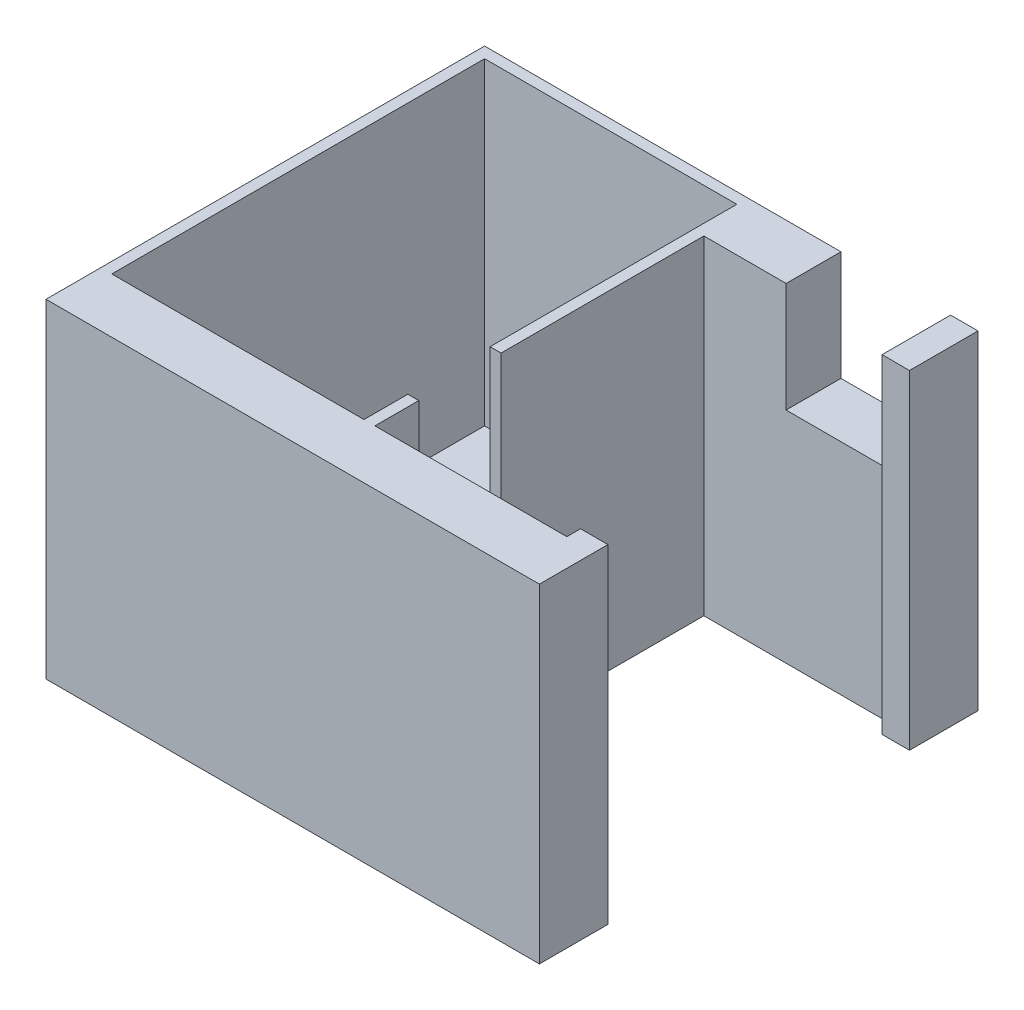
ISO-10303-21;
HEADER;
FILE_DESCRIPTION(('STEP AP214'),'2;1');
FILE_NAME('part.step','',(''),(''),'','','');
FILE_SCHEMA(('AUTOMOTIVE_DESIGN { 1 0 10303 214 1 1 1 1 }'));
ENDSEC;
DATA;
#1=APPLICATION_CONTEXT('core data for automotive mechanical design processes');
#2=APPLICATION_PROTOCOL_DEFINITION('international standard','automotive_design',2000,#1);
#3=PRODUCT_CONTEXT('',#1,'mechanical');
#4=PRODUCT('Part','Part','',(#3));
#5=PRODUCT_RELATED_PRODUCT_CATEGORY('part','',(#4));
#6=PRODUCT_DEFINITION_FORMATION('','',#4);
#7=PRODUCT_DEFINITION_CONTEXT('part definition',#1,'design');
#8=PRODUCT_DEFINITION('design','',#6,#7);
#9=PRODUCT_DEFINITION_SHAPE('','',#8);
#10=(LENGTH_UNIT() NAMED_UNIT(*) SI_UNIT(.MILLI.,.METRE.));
#11=(NAMED_UNIT(*) PLANE_ANGLE_UNIT() SI_UNIT($,.RADIAN.));
#12=(NAMED_UNIT(*) SI_UNIT($,.STERADIAN.) SOLID_ANGLE_UNIT());
#13=UNCERTAINTY_MEASURE_WITH_UNIT(LENGTH_MEASURE(1.E-05),#10,'distance_accuracy_value','');
#14=(GEOMETRIC_REPRESENTATION_CONTEXT(3) GLOBAL_UNCERTAINTY_ASSIGNED_CONTEXT((#13)) GLOBAL_UNIT_ASSIGNED_CONTEXT((#10,
#11,#12)) REPRESENTATION_CONTEXT('',''));
#15=CARTESIAN_POINT('',(0.,0.,0.));
#16=DIRECTION('',(0.,0.,1.));
#17=DIRECTION('',(1.,0.,0.));
#18=AXIS2_PLACEMENT_3D('',#15,#16,#17);
#19=CARTESIAN_POINT('',(0.,60.,0.));
#20=DIRECTION('',(0.,1.,0.));
#21=DIRECTION('',(0.,0.,1.));
#22=AXIS2_PLACEMENT_3D('',#19,#20,#21);
#23=PLANE('',#22);
#24=DIRECTION('',(1.,0.,0.));
#25=VECTOR('',#24,1.);
#26=CARTESIAN_POINT('',(29.8030592734225,60.,38.2284894837476));
#27=LINE('',#26,#25);
#28=CARTESIAN_POINT('',(34.8030592734225,60.,38.2284894837476));
#29=VERTEX_POINT('',#28);
#30=CARTESIAN_POINT('',(39.8030592734225,60.,38.2284894837476));
#31=VERTEX_POINT('',#30);
#32=EDGE_CURVE('E197',#29,#31,#27,.T.);
#33=ORIENTED_EDGE('',*,*,#32,.F.);
#34=DIRECTION('',(0.,0.,-1.));
#35=VECTOR('',#34,1.);
#36=CARTESIAN_POINT('',(34.8030592734225,60.,-19.2715105162524));
#37=LINE('',#36,#35);
#38=CARTESIAN_POINT('',(34.8030592734225,60.,40.7284894837476));
#39=VERTEX_POINT('',#38);
#40=EDGE_CURVE('E455',#39,#29,#37,.T.);
#41=ORIENTED_EDGE('',*,*,#40,.F.);
#42=DIRECTION('',(1.,0.,0.));
#43=VECTOR('',#42,1.);
#44=CARTESIAN_POINT('',(-0.196940726577458,60.,40.7284894837476));
#45=LINE('',#44,#43);
#46=CARTESIAN_POINT('',(-0.196940726577458,60.,40.7284894837476));
#47=VERTEX_POINT('',#46);
#48=EDGE_CURVE('E451',#47,#39,#45,.T.);
#49=ORIENTED_EDGE('',*,*,#48,.F.);
#50=DIRECTION('',(0.,0.,1.));
#51=VECTOR('',#50,1.);
#52=CARTESIAN_POINT('',(-0.196940726577466,60.,-19.2715105162524));
#53=LINE('',#52,#51);
#54=CARTESIAN_POINT('',(-0.196940726577458,60.,32.7284894837476));
#55=VERTEX_POINT('',#54);
#56=EDGE_CURVE('E277',#55,#47,#53,.T.);
#57=ORIENTED_EDGE('',*,*,#56,.F.);
#58=DIRECTION('',(-1.,0.,0.));
#59=VECTOR('',#58,1.);
#60=CARTESIAN_POINT('',(52.0045918179753,60.,32.7284894837476));
#61=LINE('',#60,#59);
#62=CARTESIAN_POINT('',(-2.19694072657747,60.,32.7284894837476));
#63=VERTEX_POINT('',#62);
#64=EDGE_CURVE('E379',#55,#63,#61,.T.);
#65=ORIENTED_EDGE('',*,*,#64,.T.);
#66=DIRECTION('',(0.,0.,1.));
#67=VECTOR('',#66,1.);
#68=CARTESIAN_POINT('',(-2.19694072657747,60.,0.));
#69=LINE('',#68,#67);
#70=CARTESIAN_POINT('',(-2.19694072657747,60.,40.7284894837476));
#71=VERTEX_POINT('',#70);
#72=EDGE_CURVE('E421',#63,#71,#69,.T.);
#73=ORIENTED_EDGE('',*,*,#72,.T.);
#74=DIRECTION('',(-1.,0.,0.));
#75=VECTOR('',#74,1.);
#76=CARTESIAN_POINT('',(0.,60.,40.7284894837476));
#77=LINE('',#76,#75);
#78=CARTESIAN_POINT('',(-48.1969407265775,60.,40.7284894837476));
#79=VERTEX_POINT('',#78);
#80=EDGE_CURVE('E426',#71,#79,#77,.T.);
#81=ORIENTED_EDGE('',*,*,#80,.T.);
#82=DIRECTION('',(0.,0.,-1.));
#83=VECTOR('',#82,1.);
#84=CARTESIAN_POINT('',(-48.1969407265775,60.,0.));
#85=LINE('',#84,#83);
#86=CARTESIAN_POINT('',(-48.1969407265775,60.,-27.2715105162524));
#87=VERTEX_POINT('',#86);
#88=EDGE_CURVE('E400',#79,#87,#85,.T.);
#89=ORIENTED_EDGE('',*,*,#88,.T.);
#90=DIRECTION('',(1.,0.,0.));
#91=VECTOR('',#90,1.);
#92=CARTESIAN_POINT('',(0.,60.,-27.2715105162524));
#93=LINE('',#92,#91);
#94=CARTESIAN_POINT('',(-2.19694072657747,60.,-27.2715105162524));
#95=VERTEX_POINT('',#94);
#96=EDGE_CURVE('E417',#87,#95,#93,.T.);
#97=ORIENTED_EDGE('',*,*,#96,.T.);
#98=CARTESIAN_POINT('',(-2.19694072657747,60.,17.7284894837476));
#99=VERTEX_POINT('',#98);
#100=EDGE_CURVE('E422',#95,#99,#69,.T.);
#101=ORIENTED_EDGE('',*,*,#100,.T.);
#102=DIRECTION('',(-1.,0.,0.));
#103=VECTOR('',#102,1.);
#104=CARTESIAN_POINT('',(52.0045918179753,60.,17.7284894837476));
#105=LINE('',#104,#103);
#106=CARTESIAN_POINT('',(-0.196940726577458,60.,17.7284894837476));
#107=VERTEX_POINT('',#106);
#108=EDGE_CURVE('E368',#107,#99,#105,.T.);
#109=ORIENTED_EDGE('',*,*,#108,.F.);
#110=CARTESIAN_POINT('',(-0.196940726577466,60.,-19.2715105162524));
#111=VERTEX_POINT('',#110);
#112=EDGE_CURVE('E447',#111,#107,#53,.T.);
#113=ORIENTED_EDGE('',*,*,#112,.F.);
#114=DIRECTION('',(-1.,0.,0.));
#115=VECTOR('',#114,1.);
#116=CARTESIAN_POINT('',(-0.196940726577466,60.,-19.2715105162524));
#117=LINE('',#116,#115);
#118=CARTESIAN_POINT('',(14.8030592734225,60.,-19.2715105162524));
#119=VERTEX_POINT('',#118);
#120=EDGE_CURVE('E282',#119,#111,#117,.T.);
#121=ORIENTED_EDGE('',*,*,#120,.F.);
#122=DIRECTION('',(0.,0.,-1.));
#123=VECTOR('',#122,1.);
#124=CARTESIAN_POINT('',(14.8030592734225,60.,9.01276073120952));
#125=LINE('',#124,#123);
#126=CARTESIAN_POINT('',(14.8030592734225,60.,-29.2715105162524));
#127=VERTEX_POINT('',#126);
#128=EDGE_CURVE('E324',#119,#127,#125,.T.);
#129=ORIENTED_EDGE('',*,*,#128,.T.);
#130=DIRECTION('',(-1.,0.,0.));
#131=VECTOR('',#130,1.);
#132=CARTESIAN_POINT('',(-50.1969407265775,60.,-29.2715105162524));
#133=LINE('',#132,#131);
#134=CARTESIAN_POINT('',(-50.1969407265775,60.,-29.2715105162524));
#135=VERTEX_POINT('',#134);
#136=EDGE_CURVE('E303',#127,#135,#133,.T.);
#137=ORIENTED_EDGE('',*,*,#136,.T.);
#138=DIRECTION('',(0.,0.,1.));
#139=VECTOR('',#138,1.);
#140=CARTESIAN_POINT('',(-50.1969407265775,60.,-29.2715105162524));
#141=LINE('',#140,#139);
#142=CARTESIAN_POINT('',(-50.1969407265774,60.,50.7284894837476));
#143=VERTEX_POINT('',#142);
#144=EDGE_CURVE('E227',#135,#143,#141,.T.);
#145=ORIENTED_EDGE('',*,*,#144,.T.);
#146=DIRECTION('',(1.,0.,0.));
#147=VECTOR('',#146,1.);
#148=CARTESIAN_POINT('',(-50.1969407265774,60.,50.7284894837476));
#149=LINE('',#148,#147);
#150=CARTESIAN_POINT('',(39.8030592734225,60.,50.7284894837476));
#151=VERTEX_POINT('',#150);
#152=EDGE_CURVE('E296',#143,#151,#149,.T.);
#153=ORIENTED_EDGE('',*,*,#152,.T.);
#154=DIRECTION('',(0.,0.,-1.));
#155=VECTOR('',#154,1.);
#156=CARTESIAN_POINT('',(39.8030592734225,60.,-29.2715105162524));
#157=LINE('',#156,#155);
#158=EDGE_CURVE('E300',#151,#31,#157,.T.);
#159=ORIENTED_EDGE('',*,*,#158,.T.);
#160=EDGE_LOOP('',(#33,#41,#49,#57,#65,#73,#81,#89,#97,#101,#109,#113,#121,#129,#137,#145,#153,#159));
#161=FACE_BOUND('',#160,.T.);
#162=ADVANCED_FACE('F41',(#161),#23,.T.);
#163=CARTESIAN_POINT('',(39.8030592734225,60.,-29.2715105162524));
#164=DIRECTION('',(-1.,0.,0.));
#165=DIRECTION('',(0.,0.,1.));
#166=AXIS2_PLACEMENT_3D('',#163,#164,#165);
#167=PLANE('',#166);
#168=DIRECTION('',(0.,0.,-1.));
#169=VECTOR('',#168,1.);
#170=CARTESIAN_POINT('',(39.8030592734225,0.,-29.2715105162524));
#171=LINE('',#170,#169);
#172=CARTESIAN_POINT('',(39.8030592734225,0.,50.7284894837476));
#173=VERTEX_POINT('',#172);
#174=CARTESIAN_POINT('',(39.8030592734225,0.,38.2284894837476));
#175=VERTEX_POINT('',#174);
#176=EDGE_CURVE('E210',#173,#175,#171,.T.);
#177=ORIENTED_EDGE('',*,*,#176,.T.);
#178=DIRECTION('',(0.,-1.,0.));
#179=VECTOR('',#178,1.);
#180=CARTESIAN_POINT('',(39.8030592734225,60.,38.2284894837476));
#181=LINE('',#180,#179);
#182=EDGE_CURVE('E194',#31,#175,#181,.T.);
#183=ORIENTED_EDGE('',*,*,#182,.F.);
#184=ORIENTED_EDGE('',*,*,#158,.F.);
#185=DIRECTION('',(0.,-1.,0.));
#186=VECTOR('',#185,1.);
#187=CARTESIAN_POINT('',(39.8030592734225,60.,50.7284894837476));
#188=LINE('',#187,#186);
#189=EDGE_CURVE('E220',#151,#173,#188,.T.);
#190=ORIENTED_EDGE('',*,*,#189,.T.);
#191=EDGE_LOOP('',(#177,#183,#184,#190));
#192=FACE_BOUND('',#191,.T.);
#193=ADVANCED_FACE('F218',(#192),#167,.F.);
#194=CARTESIAN_POINT('',(34.8030592734225,60.,-19.2715105162524));
#195=DIRECTION('',(-1.,0.,0.));
#196=DIRECTION('',(0.,0.,1.));
#197=AXIS2_PLACEMENT_3D('',#194,#195,#196);
#198=PLANE('',#197);
#199=DIRECTION('',(0.,1.,0.));
#200=VECTOR('',#199,1.);
#201=CARTESIAN_POINT('',(34.8030592734225,60.,38.2284894837476));
#202=LINE('',#201,#200);
#203=CARTESIAN_POINT('',(34.8030592734225,0.,38.2284894837476));
#204=VERTEX_POINT('',#203);
#205=EDGE_CURVE('E12',#204,#29,#202,.T.);
#206=ORIENTED_EDGE('',*,*,#205,.F.);
#207=DIRECTION('',(0.,0.,-1.));
#208=VECTOR('',#207,1.);
#209=CARTESIAN_POINT('',(34.8030592734225,0.,-19.2715105162524));
#210=LINE('',#209,#208);
#211=CARTESIAN_POINT('',(34.8030592734225,0.,40.7284894837476));
#212=VERTEX_POINT('',#211);
#213=EDGE_CURVE('E213',#212,#204,#210,.T.);
#214=ORIENTED_EDGE('',*,*,#213,.F.);
#215=DIRECTION('',(0.,-1.,0.));
#216=VECTOR('',#215,1.);
#217=CARTESIAN_POINT('',(34.8030592734225,60.,40.7284894837476));
#218=LINE('',#217,#216);
#219=EDGE_CURVE('E285',#39,#212,#218,.T.);
#220=ORIENTED_EDGE('',*,*,#219,.F.);
#221=ORIENTED_EDGE('',*,*,#40,.T.);
#222=EDGE_LOOP('',(#206,#214,#220,#221));
#223=FACE_BOUND('',#222,.T.);
#224=ADVANCED_FACE('F529',(#223),#198,.T.);
#225=DIRECTION('',(1.,0.,0.));
#226=VECTOR('',#225,1.);
#227=CARTESIAN_POINT('',(29.8030592734225,60.,-16.7715105162524));
#228=LINE('',#227,#226);
#229=CARTESIAN_POINT('',(34.8030592734225,60.,-16.7715105162524));
#230=VERTEX_POINT('',#229);
#231=CARTESIAN_POINT('',(39.8030592734225,60.,-16.7715105162524));
#232=VERTEX_POINT('',#231);
#233=EDGE_CURVE('E57',#230,#232,#228,.T.);
#234=ORIENTED_EDGE('',*,*,#233,.T.);
#235=CARTESIAN_POINT('',(39.8030592734225,60.,-29.2715105162524));
#236=VERTEX_POINT('',#235);
#237=EDGE_CURVE('E299',#232,#236,#157,.T.);
#238=ORIENTED_EDGE('',*,*,#237,.T.);
#239=CARTESIAN_POINT('',(34.8030592734225,60.,-29.2715105162524));
#240=VERTEX_POINT('',#239);
#241=EDGE_CURVE('E238',#236,#240,#133,.T.);
#242=ORIENTED_EDGE('',*,*,#241,.T.);
#243=EDGE_CURVE('E454',#230,#240,#37,.T.);
#244=ORIENTED_EDGE('',*,*,#243,.F.);
#245=EDGE_LOOP('',(#234,#238,#242,#244));
#246=FACE_BOUND('',#245,.T.);
#247=ADVANCED_FACE('F330',(#246),#23,.T.);
#248=CARTESIAN_POINT('',(0.,0.,0.));
#249=DIRECTION('',(0.,1.,0.));
#250=DIRECTION('',(0.,0.,1.));
#251=AXIS2_PLACEMENT_3D('',#248,#249,#250);
#252=PLANE('',#251);
#253=ORIENTED_EDGE('',*,*,#213,.T.);
#254=DIRECTION('',(1.,0.,0.));
#255=VECTOR('',#254,1.);
#256=CARTESIAN_POINT('',(29.8030592734225,0.,38.2284894837476));
#257=LINE('',#256,#255);
#258=EDGE_CURVE('E64',#204,#175,#257,.T.);
#259=ORIENTED_EDGE('',*,*,#258,.T.);
#260=ORIENTED_EDGE('',*,*,#176,.F.);
#261=DIRECTION('',(1.,0.,0.));
#262=VECTOR('',#261,1.);
#263=CARTESIAN_POINT('',(-50.1969407265774,0.,50.7284894837476));
#264=LINE('',#263,#262);
#265=CARTESIAN_POINT('',(-50.1969407265774,0.,50.7284894837476));
#266=VERTEX_POINT('',#265);
#267=EDGE_CURVE('E229',#266,#173,#264,.T.);
#268=ORIENTED_EDGE('',*,*,#267,.F.);
#269=DIRECTION('',(0.,0.,1.));
#270=VECTOR('',#269,1.);
#271=CARTESIAN_POINT('',(-50.1969407265775,0.,-29.2715105162524));
#272=LINE('',#271,#270);
#273=CARTESIAN_POINT('',(-50.1969407265775,0.,-29.2715105162524));
#274=VERTEX_POINT('',#273);
#275=EDGE_CURVE('E292',#274,#266,#272,.T.);
#276=ORIENTED_EDGE('',*,*,#275,.F.);
#277=DIRECTION('',(-1.,0.,0.));
#278=VECTOR('',#277,1.);
#279=CARTESIAN_POINT('',(-50.1969407265775,0.,-29.2715105162524));
#280=LINE('',#279,#278);
#281=CARTESIAN_POINT('',(39.8030592734225,0.,-29.2715105162524));
#282=VERTEX_POINT('',#281);
#283=EDGE_CURVE('E222',#282,#274,#280,.T.);
#284=ORIENTED_EDGE('',*,*,#283,.F.);
#285=CARTESIAN_POINT('',(39.8030592734225,0.,-16.7715105162524));
#286=VERTEX_POINT('',#285);
#287=EDGE_CURVE('E223',#286,#282,#171,.T.);
#288=ORIENTED_EDGE('',*,*,#287,.F.);
#289=DIRECTION('',(1.,0.,0.));
#290=VECTOR('',#289,1.);
#291=CARTESIAN_POINT('',(29.8030592734225,0.,-16.7715105162524));
#292=LINE('',#291,#290);
#293=CARTESIAN_POINT('',(34.8030592734225,0.,-16.7715105162524));
#294=VERTEX_POINT('',#293);
#295=EDGE_CURVE('E215',#294,#286,#292,.T.);
#296=ORIENTED_EDGE('',*,*,#295,.F.);
#297=CARTESIAN_POINT('',(34.8030592734225,0.,-19.2715105162524));
#298=VERTEX_POINT('',#297);
#299=EDGE_CURVE('E256',#294,#298,#210,.T.);
#300=ORIENTED_EDGE('',*,*,#299,.T.);
#301=DIRECTION('',(-1.,0.,0.));
#302=VECTOR('',#301,1.);
#303=CARTESIAN_POINT('',(-0.196940726577466,0.,-19.2715105162524));
#304=LINE('',#303,#302);
#305=CARTESIAN_POINT('',(-0.196940726577466,0.,-19.2715105162524));
#306=VERTEX_POINT('',#305);
#307=EDGE_CURVE('E270',#298,#306,#304,.T.);
#308=ORIENTED_EDGE('',*,*,#307,.T.);
#309=DIRECTION('',(0.,0.,1.));
#310=VECTOR('',#309,1.);
#311=CARTESIAN_POINT('',(-0.196940726577466,0.,-19.2715105162524));
#312=LINE('',#311,#310);
#313=CARTESIAN_POINT('',(-0.196940726577458,0.,40.7284894837476));
#314=VERTEX_POINT('',#313);
#315=EDGE_CURVE('E271',#306,#314,#312,.T.);
#316=ORIENTED_EDGE('',*,*,#315,.T.);
#317=DIRECTION('',(1.,0.,0.));
#318=VECTOR('',#317,1.);
#319=CARTESIAN_POINT('',(-0.196940726577458,0.,40.7284894837476));
#320=LINE('',#319,#318);
#321=EDGE_CURVE('E266',#314,#212,#320,.T.);
#322=ORIENTED_EDGE('',*,*,#321,.T.);
#323=EDGE_LOOP('',(#253,#259,#260,#268,#276,#284,#288,#296,#300,#308,#316,#322));
#324=FACE_BOUND('',#323,.T.);
#325=ADVANCED_FACE('F209',(#324),#252,.F.);
#326=CARTESIAN_POINT('',(-50.1969407265775,60.,-29.2715105162524));
#327=DIRECTION('',(1.,0.,0.));
#328=DIRECTION('',(0.,0.,-1.));
#329=AXIS2_PLACEMENT_3D('',#326,#327,#328);
#330=PLANE('',#329);
#331=ORIENTED_EDGE('',*,*,#275,.T.);
#332=DIRECTION('',(0.,-1.,0.));
#333=VECTOR('',#332,1.);
#334=CARTESIAN_POINT('',(-50.1969407265774,60.,50.7284894837476));
#335=LINE('',#334,#333);
#336=EDGE_CURVE('E244',#143,#266,#335,.T.);
#337=ORIENTED_EDGE('',*,*,#336,.F.);
#338=ORIENTED_EDGE('',*,*,#144,.F.);
#339=DIRECTION('',(0.,-1.,0.));
#340=VECTOR('',#339,1.);
#341=CARTESIAN_POINT('',(-50.1969407265775,60.,-29.2715105162524));
#342=LINE('',#341,#340);
#343=EDGE_CURVE('E233',#135,#274,#342,.T.);
#344=ORIENTED_EDGE('',*,*,#343,.T.);
#345=EDGE_LOOP('',(#331,#337,#338,#344));
#346=FACE_BOUND('',#345,.T.);
#347=ADVANCED_FACE('F43',(#346),#330,.F.);
#348=CARTESIAN_POINT('',(-50.1969407265774,60.,50.7284894837476));
#349=DIRECTION('',(0.,0.,-1.));
#350=DIRECTION('',(-1.,0.,0.));
#351=AXIS2_PLACEMENT_3D('',#348,#349,#350);
#352=PLANE('',#351);
#353=ORIENTED_EDGE('',*,*,#267,.T.);
#354=ORIENTED_EDGE('',*,*,#189,.F.);
#355=ORIENTED_EDGE('',*,*,#152,.F.);
#356=ORIENTED_EDGE('',*,*,#336,.T.);
#357=EDGE_LOOP('',(#353,#354,#355,#356));
#358=FACE_BOUND('',#357,.T.);
#359=ADVANCED_FACE('F313',(#358),#352,.F.);
#360=ORIENTED_EDGE('',*,*,#237,.F.);
#361=DIRECTION('',(0.,1.,0.));
#362=VECTOR('',#361,1.);
#363=CARTESIAN_POINT('',(39.8030592734225,60.,-16.7715105162524));
#364=LINE('',#363,#362);
#365=EDGE_CURVE('E203',#286,#232,#364,.T.);
#366=ORIENTED_EDGE('',*,*,#365,.F.);
#367=ORIENTED_EDGE('',*,*,#287,.T.);
#368=DIRECTION('',(0.,-1.,0.));
#369=VECTOR('',#368,1.);
#370=CARTESIAN_POINT('',(39.8030592734225,60.,-29.2715105162524));
#371=LINE('',#370,#369);
#372=EDGE_CURVE('E237',#236,#282,#371,.T.);
#373=ORIENTED_EDGE('',*,*,#372,.F.);
#374=EDGE_LOOP('',(#360,#366,#367,#373));
#375=FACE_BOUND('',#374,.T.);
#376=ADVANCED_FACE('F332',(#375),#167,.F.);
#377=CARTESIAN_POINT('',(-50.1969407265775,60.,-29.2715105162524));
#378=DIRECTION('',(0.,0.,1.));
#379=DIRECTION('',(1.,0.,0.));
#380=AXIS2_PLACEMENT_3D('',#377,#378,#379);
#381=PLANE('',#380);
#382=CARTESIAN_POINT('',(-5.19694072657746,30.,-29.2715105162524));
#383=DIRECTION('',(0.,0.,-1.));
#384=DIRECTION('',(-1.,0.,0.));
#385=AXIS2_PLACEMENT_3D('',#382,#383,#384);
#386=CIRCLE('',#385,3.15);
#387=CARTESIAN_POINT('',(-8.34694072657746,30.,-29.2715105162524));
#388=VERTEX_POINT('',#387);
#389=EDGE_CURVE('E498',#388,#388,#386,.T.);
#390=ORIENTED_EDGE('',*,*,#389,.F.);
#391=EDGE_LOOP('',(#390));
#392=FACE_BOUND('',#391,.T.);
#393=ORIENTED_EDGE('',*,*,#136,.F.);
#394=DIRECTION('',(0.,1.,0.));
#395=VECTOR('',#394,1.);
#396=CARTESIAN_POINT('',(14.8030592734225,60.,-29.2715105162524));
#397=LINE('',#396,#395);
#398=CARTESIAN_POINT('',(14.8030592734225,40.,-29.2715105162524));
#399=VERTEX_POINT('',#398);
#400=EDGE_CURVE('E343',#399,#127,#397,.T.);
#401=ORIENTED_EDGE('',*,*,#400,.F.);
#402=DIRECTION('',(-1.,0.,0.));
#403=VECTOR('',#402,1.);
#404=CARTESIAN_POINT('',(34.8030592734225,40.,-29.2715105162524));
#405=LINE('',#404,#403);
#406=CARTESIAN_POINT('',(34.8030592734225,40.,-29.2715105162524));
#407=VERTEX_POINT('',#406);
#408=EDGE_CURVE('E338',#407,#399,#405,.T.);
#409=ORIENTED_EDGE('',*,*,#408,.F.);
#410=DIRECTION('',(0.,-1.,0.));
#411=VECTOR('',#410,1.);
#412=CARTESIAN_POINT('',(34.8030592734225,60.,-29.2715105162524));
#413=LINE('',#412,#411);
#414=EDGE_CURVE('E336',#240,#407,#413,.T.);
#415=ORIENTED_EDGE('',*,*,#414,.F.);
#416=ORIENTED_EDGE('',*,*,#241,.F.);
#417=ORIENTED_EDGE('',*,*,#372,.T.);
#418=ORIENTED_EDGE('',*,*,#283,.T.);
#419=ORIENTED_EDGE('',*,*,#343,.F.);
#420=EDGE_LOOP('',(#393,#401,#409,#415,#416,#417,#418,#419));
#421=FACE_BOUND('',#420,.T.);
#422=ADVANCED_FACE('F317',(#392,#421),#381,.F.);
#423=CARTESIAN_POINT('',(-0.196940726577466,60.,-19.2715105162524));
#424=DIRECTION('',(1.,0.,0.));
#425=DIRECTION('',(0.,0.,-1.));
#426=AXIS2_PLACEMENT_3D('',#423,#424,#425);
#427=PLANE('',#426);
#428=DIRECTION('',(0.,-1.,0.));
#429=VECTOR('',#428,1.);
#430=CARTESIAN_POINT('',(-0.196940726577458,60.,17.7284894837476));
#431=LINE('',#430,#429);
#432=CARTESIAN_POINT('',(-0.196940726577458,9.99999999999999,17.7284894837476));
#433=VERTEX_POINT('',#432);
#434=EDGE_CURVE('E386',#107,#433,#431,.T.);
#435=ORIENTED_EDGE('',*,*,#434,.T.);
#436=DIRECTION('',(0.,0.,1.));
#437=VECTOR('',#436,1.);
#438=CARTESIAN_POINT('',(-0.196940726577458,10.,32.7284894837476));
#439=LINE('',#438,#437);
#440=CARTESIAN_POINT('',(-0.196940726577458,10.,32.7284894837476));
#441=VERTEX_POINT('',#440);
#442=EDGE_CURVE('E381',#433,#441,#439,.T.);
#443=ORIENTED_EDGE('',*,*,#442,.T.);
#444=DIRECTION('',(0.,1.,0.));
#445=VECTOR('',#444,1.);
#446=CARTESIAN_POINT('',(-0.196940726577458,60.,32.7284894837476));
#447=LINE('',#446,#445);
#448=EDGE_CURVE('E375',#441,#55,#447,.T.);
#449=ORIENTED_EDGE('',*,*,#448,.T.);
#450=ORIENTED_EDGE('',*,*,#56,.T.);
#451=DIRECTION('',(0.,-1.,0.));
#452=VECTOR('',#451,1.);
#453=CARTESIAN_POINT('',(-0.196940726577458,60.,40.7284894837476));
#454=LINE('',#453,#452);
#455=EDGE_CURVE('E288',#47,#314,#454,.T.);
#456=ORIENTED_EDGE('',*,*,#455,.T.);
#457=ORIENTED_EDGE('',*,*,#315,.F.);
#458=DIRECTION('',(0.,-1.,0.));
#459=VECTOR('',#458,1.);
#460=CARTESIAN_POINT('',(-0.196940726577466,60.,-19.2715105162524));
#461=LINE('',#460,#459);
#462=EDGE_CURVE('E278',#111,#306,#461,.T.);
#463=ORIENTED_EDGE('',*,*,#462,.F.);
#464=ORIENTED_EDGE('',*,*,#112,.T.);
#465=EDGE_LOOP('',(#435,#443,#449,#450,#456,#457,#463,#464));
#466=FACE_BOUND('',#465,.T.);
#467=ADVANCED_FACE('F464',(#466),#427,.T.);
#468=CARTESIAN_POINT('',(-0.196940726577458,60.,40.7284894837476));
#469=DIRECTION('',(0.,0.,-1.));
#470=DIRECTION('',(-1.,0.,0.));
#471=AXIS2_PLACEMENT_3D('',#468,#469,#470);
#472=PLANE('',#471);
#473=ORIENTED_EDGE('',*,*,#321,.F.);
#474=ORIENTED_EDGE('',*,*,#455,.F.);
#475=ORIENTED_EDGE('',*,*,#48,.T.);
#476=ORIENTED_EDGE('',*,*,#219,.T.);
#477=EDGE_LOOP('',(#473,#474,#475,#476));
#478=FACE_BOUND('',#477,.T.);
#479=ADVANCED_FACE('F520',(#478),#472,.T.);
#480=DIRECTION('',(0.,-1.,0.));
#481=VECTOR('',#480,1.);
#482=CARTESIAN_POINT('',(34.8030592734225,60.,-16.7715105162524));
#483=LINE('',#482,#481);
#484=EDGE_CURVE('E50',#230,#294,#483,.T.);
#485=ORIENTED_EDGE('',*,*,#484,.F.);
#486=ORIENTED_EDGE('',*,*,#243,.T.);
#487=ORIENTED_EDGE('',*,*,#414,.T.);
#488=DIRECTION('',(0.,0.,-1.));
#489=VECTOR('',#488,1.);
#490=CARTESIAN_POINT('',(34.8030592734225,40.,9.01276073120952));
#491=LINE('',#490,#489);
#492=CARTESIAN_POINT('',(34.8030592734225,40.,-19.2715105162524));
#493=VERTEX_POINT('',#492);
#494=EDGE_CURVE('E359',#493,#407,#491,.T.);
#495=ORIENTED_EDGE('',*,*,#494,.F.);
#496=DIRECTION('',(0.,-1.,0.));
#497=VECTOR('',#496,1.);
#498=CARTESIAN_POINT('',(34.8030592734225,60.,-19.2715105162524));
#499=LINE('',#498,#497);
#500=EDGE_CURVE('E263',#493,#298,#499,.T.);
#501=ORIENTED_EDGE('',*,*,#500,.T.);
#502=ORIENTED_EDGE('',*,*,#299,.F.);
#503=EDGE_LOOP('',(#485,#486,#487,#495,#501,#502));
#504=FACE_BOUND('',#503,.T.);
#505=ADVANCED_FACE('F261',(#504),#198,.T.);
#506=CARTESIAN_POINT('',(-0.196940726577466,60.,-19.2715105162524));
#507=DIRECTION('',(0.,0.,1.));
#508=DIRECTION('',(1.,0.,0.));
#509=AXIS2_PLACEMENT_3D('',#506,#507,#508);
#510=PLANE('',#509);
#511=DIRECTION('',(-1.,0.,0.));
#512=VECTOR('',#511,1.);
#513=CARTESIAN_POINT('',(34.8030592734225,40.,-19.2715105162524));
#514=LINE('',#513,#512);
#515=CARTESIAN_POINT('',(14.8030592734225,40.,-19.2715105162524));
#516=VERTEX_POINT('',#515);
#517=EDGE_CURVE('E348',#493,#516,#514,.T.);
#518=ORIENTED_EDGE('',*,*,#517,.T.);
#519=DIRECTION('',(0.,1.,0.));
#520=VECTOR('',#519,1.);
#521=CARTESIAN_POINT('',(14.8030592734225,60.,-19.2715105162524));
#522=LINE('',#521,#520);
#523=EDGE_CURVE('E353',#516,#119,#522,.T.);
#524=ORIENTED_EDGE('',*,*,#523,.T.);
#525=ORIENTED_EDGE('',*,*,#120,.T.);
#526=ORIENTED_EDGE('',*,*,#462,.T.);
#527=ORIENTED_EDGE('',*,*,#307,.F.);
#528=ORIENTED_EDGE('',*,*,#500,.F.);
#529=EDGE_LOOP('',(#518,#524,#525,#526,#527,#528));
#530=FACE_BOUND('',#529,.T.);
#531=ADVANCED_FACE('F468',(#530),#510,.T.);
#532=CARTESIAN_POINT('',(0.,-82.0975030070952,40.7284894837476));
#533=DIRECTION('',(0.,0.,-1.));
#534=DIRECTION('',(-1.,0.,0.));
#535=AXIS2_PLACEMENT_3D('',#532,#533,#534);
#536=PLANE('',#535);
#537=DIRECTION('',(0.,1.,0.));
#538=VECTOR('',#537,1.);
#539=CARTESIAN_POINT('',(-48.1969407265775,-82.0975030070952,40.7284894837476));
#540=LINE('',#539,#538);
#541=CARTESIAN_POINT('',(-48.1969407265775,2.,40.7284894837476));
#542=VERTEX_POINT('',#541);
#543=EDGE_CURVE('E430',#542,#79,#540,.T.);
#544=ORIENTED_EDGE('',*,*,#543,.T.);
#545=ORIENTED_EDGE('',*,*,#80,.F.);
#546=DIRECTION('',(0.,1.,0.));
#547=VECTOR('',#546,1.);
#548=CARTESIAN_POINT('',(-2.19694072657747,-82.0975030070952,40.7284894837476));
#549=LINE('',#548,#547);
#550=CARTESIAN_POINT('',(-2.19694072657747,2.,40.7284894837476));
#551=VERTEX_POINT('',#550);
#552=EDGE_CURVE('E433',#551,#71,#549,.T.);
#553=ORIENTED_EDGE('',*,*,#552,.F.);
#554=DIRECTION('',(1.,0.,0.));
#555=VECTOR('',#554,1.);
#556=CARTESIAN_POINT('',(0.,2.,40.7284894837476));
#557=LINE('',#556,#555);
#558=EDGE_CURVE('E406',#542,#551,#557,.T.);
#559=ORIENTED_EDGE('',*,*,#558,.F.);
#560=EDGE_LOOP('',(#544,#545,#553,#559));
#561=FACE_BOUND('',#560,.T.);
#562=ADVANCED_FACE('F546',(#561),#536,.T.);
#563=CARTESIAN_POINT('',(-2.19694072657747,-82.0975030070952,0.));
#564=DIRECTION('',(-1.,0.,0.));
#565=DIRECTION('',(0.,0.,1.));
#566=AXIS2_PLACEMENT_3D('',#563,#564,#565);
#567=PLANE('',#566);
#568=DIRECTION('',(0.,-1.,0.));
#569=VECTOR('',#568,1.);
#570=CARTESIAN_POINT('',(-2.19694072657747,60.,17.7284894837476));
#571=LINE('',#570,#569);
#572=CARTESIAN_POINT('',(-2.19694072657747,9.99999999999999,17.7284894837476));
#573=VERTEX_POINT('',#572);
#574=EDGE_CURVE('E369',#99,#573,#571,.T.);
#575=ORIENTED_EDGE('',*,*,#574,.F.);
#576=ORIENTED_EDGE('',*,*,#100,.F.);
#577=DIRECTION('',(0.,1.,0.));
#578=VECTOR('',#577,1.);
#579=CARTESIAN_POINT('',(-2.19694072657747,-82.0975030070952,-27.2715105162524));
#580=LINE('',#579,#578);
#581=CARTESIAN_POINT('',(-2.19694072657747,2.,-27.2715105162524));
#582=VERTEX_POINT('',#581);
#583=EDGE_CURVE('E437',#582,#95,#580,.T.);
#584=ORIENTED_EDGE('',*,*,#583,.F.);
#585=DIRECTION('',(0.,0.,-1.));
#586=VECTOR('',#585,1.);
#587=CARTESIAN_POINT('',(-2.19694072657747,2.,0.));
#588=LINE('',#587,#586);
#589=EDGE_CURVE('E401',#551,#582,#588,.T.);
#590=ORIENTED_EDGE('',*,*,#589,.F.);
#591=ORIENTED_EDGE('',*,*,#552,.T.);
#592=ORIENTED_EDGE('',*,*,#72,.F.);
#593=DIRECTION('',(0.,1.,0.));
#594=VECTOR('',#593,1.);
#595=CARTESIAN_POINT('',(-2.19694072657747,60.,32.7284894837476));
#596=LINE('',#595,#594);
#597=CARTESIAN_POINT('',(-2.19694072657747,9.99999999999999,32.7284894837476));
#598=VERTEX_POINT('',#597);
#599=EDGE_CURVE('E364',#598,#63,#596,.T.);
#600=ORIENTED_EDGE('',*,*,#599,.F.);
#601=DIRECTION('',(0.,0.,1.));
#602=VECTOR('',#601,1.);
#603=CARTESIAN_POINT('',(-2.19694072657747,10.,32.7284894837476));
#604=LINE('',#603,#602);
#605=EDGE_CURVE('E365',#573,#598,#604,.T.);
#606=ORIENTED_EDGE('',*,*,#605,.F.);
#607=EDGE_LOOP('',(#575,#576,#584,#590,#591,#592,#600,#606));
#608=FACE_BOUND('',#607,.T.);
#609=ADVANCED_FACE('F483',(#608),#567,.T.);
#610=CARTESIAN_POINT('',(0.,-82.0975030070952,-27.2715105162524));
#611=DIRECTION('',(0.,0.,1.));
#612=DIRECTION('',(1.,0.,0.));
#613=AXIS2_PLACEMENT_3D('',#610,#611,#612);
#614=PLANE('',#613);
#615=CARTESIAN_POINT('',(-5.19694072657746,30.,-27.2715105162524));
#616=DIRECTION('',(0.,0.,1.));
#617=DIRECTION('',(1.,0.,0.));
#618=AXIS2_PLACEMENT_3D('',#615,#616,#617);
#619=CIRCLE('',#618,1.8);
#620=CARTESIAN_POINT('',(-3.39694072657746,30.,-27.2715105162524));
#621=VERTEX_POINT('',#620);
#622=EDGE_CURVE('E494',#621,#621,#619,.F.);
#623=ORIENTED_EDGE('',*,*,#622,.T.);
#624=EDGE_LOOP('',(#623));
#625=FACE_BOUND('',#624,.T.);
#626=ORIENTED_EDGE('',*,*,#583,.T.);
#627=ORIENTED_EDGE('',*,*,#96,.F.);
#628=DIRECTION('',(0.,1.,0.));
#629=VECTOR('',#628,1.);
#630=CARTESIAN_POINT('',(-48.1969407265775,-82.0975030070952,-27.2715105162524));
#631=LINE('',#630,#629);
#632=CARTESIAN_POINT('',(-48.1969407265775,2.,-27.2715105162524));
#633=VERTEX_POINT('',#632);
#634=EDGE_CURVE('E440',#633,#87,#631,.T.);
#635=ORIENTED_EDGE('',*,*,#634,.F.);
#636=DIRECTION('',(-1.,0.,0.));
#637=VECTOR('',#636,1.);
#638=CARTESIAN_POINT('',(0.,2.,-27.2715105162524));
#639=LINE('',#638,#637);
#640=EDGE_CURVE('E405',#582,#633,#639,.T.);
#641=ORIENTED_EDGE('',*,*,#640,.F.);
#642=EDGE_LOOP('',(#626,#627,#635,#641));
#643=FACE_BOUND('',#642,.T.);
#644=ADVANCED_FACE('F578',(#625,#643),#614,.T.);
#645=CARTESIAN_POINT('',(-48.1969407265775,-82.0975030070952,0.));
#646=DIRECTION('',(1.,0.,0.));
#647=DIRECTION('',(0.,0.,-1.));
#648=AXIS2_PLACEMENT_3D('',#645,#646,#647);
#649=PLANE('',#648);
#650=ORIENTED_EDGE('',*,*,#634,.T.);
#651=ORIENTED_EDGE('',*,*,#88,.F.);
#652=ORIENTED_EDGE('',*,*,#543,.F.);
#653=DIRECTION('',(0.,0.,1.));
#654=VECTOR('',#653,1.);
#655=CARTESIAN_POINT('',(-48.1969407265775,2.,0.));
#656=LINE('',#655,#654);
#657=EDGE_CURVE('E410',#633,#542,#656,.T.);
#658=ORIENTED_EDGE('',*,*,#657,.F.);
#659=EDGE_LOOP('',(#650,#651,#652,#658));
#660=FACE_BOUND('',#659,.T.);
#661=ADVANCED_FACE('F699',(#660),#649,.T.);
#662=CARTESIAN_POINT('',(0.,2.,0.));
#663=DIRECTION('',(0.,1.,0.));
#664=DIRECTION('',(0.,0.,1.));
#665=AXIS2_PLACEMENT_3D('',#662,#663,#664);
#666=PLANE('',#665);
#667=ORIENTED_EDGE('',*,*,#640,.T.);
#668=ORIENTED_EDGE('',*,*,#657,.T.);
#669=ORIENTED_EDGE('',*,*,#558,.T.);
#670=ORIENTED_EDGE('',*,*,#589,.T.);
#671=EDGE_LOOP('',(#667,#668,#669,#670));
#672=FACE_BOUND('',#671,.T.);
#673=ADVANCED_FACE('F569',(#672),#666,.T.);
#674=CARTESIAN_POINT('',(52.0045918179753,60.,17.7284894837476));
#675=DIRECTION('',(0.,0.,-1.));
#676=DIRECTION('',(0.,1.,0.));
#677=AXIS2_PLACEMENT_3D('',#674,#675,#676);
#678=PLANE('',#677);
#679=ORIENTED_EDGE('',*,*,#108,.T.);
#680=ORIENTED_EDGE('',*,*,#574,.T.);
#681=DIRECTION('',(-1.,0.,0.));
#682=VECTOR('',#681,1.);
#683=CARTESIAN_POINT('',(52.0045918179753,9.99999999999999,17.7284894837476));
#684=LINE('',#683,#682);
#685=EDGE_CURVE('E385',#433,#573,#684,.T.);
#686=ORIENTED_EDGE('',*,*,#685,.F.);
#687=ORIENTED_EDGE('',*,*,#434,.F.);
#688=EDGE_LOOP('',(#679,#680,#686,#687));
#689=FACE_BOUND('',#688,.T.);
#690=ADVANCED_FACE('F472',(#689),#678,.F.);
#691=CARTESIAN_POINT('',(52.0045918179753,10.,32.7284894837476));
#692=DIRECTION('',(0.,-1.,0.));
#693=DIRECTION('',(0.,0.,-1.));
#694=AXIS2_PLACEMENT_3D('',#691,#692,#693);
#695=PLANE('',#694);
#696=ORIENTED_EDGE('',*,*,#685,.T.);
#697=ORIENTED_EDGE('',*,*,#605,.T.);
#698=DIRECTION('',(-1.,0.,0.));
#699=VECTOR('',#698,1.);
#700=CARTESIAN_POINT('',(52.0045918179753,10.,32.7284894837476));
#701=LINE('',#700,#699);
#702=EDGE_CURVE('E380',#441,#598,#701,.T.);
#703=ORIENTED_EDGE('',*,*,#702,.F.);
#704=ORIENTED_EDGE('',*,*,#442,.F.);
#705=EDGE_LOOP('',(#696,#697,#703,#704));
#706=FACE_BOUND('',#705,.T.);
#707=ADVANCED_FACE('F476',(#706),#695,.F.);
#708=CARTESIAN_POINT('',(52.0045918179753,60.,32.7284894837476));
#709=DIRECTION('',(0.,0.,1.));
#710=DIRECTION('',(0.,-1.,0.));
#711=AXIS2_PLACEMENT_3D('',#708,#709,#710);
#712=PLANE('',#711);
#713=ORIENTED_EDGE('',*,*,#702,.T.);
#714=ORIENTED_EDGE('',*,*,#599,.T.);
#715=ORIENTED_EDGE('',*,*,#64,.F.);
#716=ORIENTED_EDGE('',*,*,#448,.F.);
#717=EDGE_LOOP('',(#713,#714,#715,#716));
#718=FACE_BOUND('',#717,.T.);
#719=ADVANCED_FACE('F480',(#718),#712,.F.);
#720=CARTESIAN_POINT('',(34.8030592734225,40.,9.01276073120952));
#721=DIRECTION('',(0.,-1.,0.));
#722=DIRECTION('',(0.,0.,-1.));
#723=AXIS2_PLACEMENT_3D('',#720,#721,#722);
#724=PLANE('',#723);
#725=ORIENTED_EDGE('',*,*,#494,.T.);
#726=ORIENTED_EDGE('',*,*,#408,.T.);
#727=DIRECTION('',(0.,0.,-1.));
#728=VECTOR('',#727,1.);
#729=CARTESIAN_POINT('',(14.8030592734225,40.,9.01276073120952));
#730=LINE('',#729,#728);
#731=EDGE_CURVE('E352',#516,#399,#730,.T.);
#732=ORIENTED_EDGE('',*,*,#731,.F.);
#733=ORIENTED_EDGE('',*,*,#517,.F.);
#734=EDGE_LOOP('',(#725,#726,#732,#733));
#735=FACE_BOUND('',#734,.T.);
#736=ADVANCED_FACE('F607',(#735),#724,.F.);
#737=CARTESIAN_POINT('',(14.8030592734225,60.,9.01276073120952));
#738=DIRECTION('',(-1.,0.,0.));
#739=DIRECTION('',(0.,-1.,0.));
#740=AXIS2_PLACEMENT_3D('',#737,#738,#739);
#741=PLANE('',#740);
#742=ORIENTED_EDGE('',*,*,#731,.T.);
#743=ORIENTED_EDGE('',*,*,#400,.T.);
#744=ORIENTED_EDGE('',*,*,#128,.F.);
#745=ORIENTED_EDGE('',*,*,#523,.F.);
#746=EDGE_LOOP('',(#742,#743,#744,#745));
#747=FACE_BOUND('',#746,.T.);
#748=ADVANCED_FACE('F625',(#747),#741,.F.);
#749=CARTESIAN_POINT('',(29.8030592734225,60.,-16.7715105162524));
#750=DIRECTION('',(0.,0.,-1.));
#751=DIRECTION('',(-1.,0.,0.));
#752=AXIS2_PLACEMENT_3D('',#749,#750,#751);
#753=PLANE('',#752);
#754=ORIENTED_EDGE('',*,*,#484,.T.);
#755=ORIENTED_EDGE('',*,*,#295,.T.);
#756=ORIENTED_EDGE('',*,*,#365,.T.);
#757=ORIENTED_EDGE('',*,*,#233,.F.);
#758=EDGE_LOOP('',(#754,#755,#756,#757));
#759=FACE_BOUND('',#758,.T.);
#760=ADVANCED_FACE('F249',(#759),#753,.F.);
#761=CARTESIAN_POINT('',(29.8030592734225,60.,38.2284894837476));
#762=DIRECTION('',(0.,0.,1.));
#763=DIRECTION('',(1.,0.,0.));
#764=AXIS2_PLACEMENT_3D('',#761,#762,#763);
#765=PLANE('',#764);
#766=ORIENTED_EDGE('',*,*,#205,.T.);
#767=ORIENTED_EDGE('',*,*,#32,.T.);
#768=ORIENTED_EDGE('',*,*,#182,.T.);
#769=ORIENTED_EDGE('',*,*,#258,.F.);
#770=EDGE_LOOP('',(#766,#767,#768,#769));
#771=FACE_BOUND('',#770,.T.);
#772=ADVANCED_FACE('F195',(#771),#765,.F.);
#773=CARTESIAN_POINT('',(-5.19694072657746,30.,-29.2715105162524));
#774=DIRECTION('',(0.,0.,-1.));
#775=DIRECTION('',(-1.,0.,0.));
#776=AXIS2_PLACEMENT_3D('',#773,#774,#775);
#777=CYLINDRICAL_SURFACE('',#776,1.8);
#778=ORIENTED_EDGE('',*,*,#622,.F.);
#779=EDGE_LOOP('',(#778));
#780=FACE_BOUND('',#779,.T.);
#781=CARTESIAN_POINT('',(-5.19694072657746,30.,-27.9215105162524));
#782=DIRECTION('',(0.,0.,-1.));
#783=DIRECTION('',(-1.,0.,0.));
#784=AXIS2_PLACEMENT_3D('',#781,#782,#783);
#785=CIRCLE('',#784,1.8);
#786=CARTESIAN_POINT('',(-6.99694072657746,30.,-27.9215105162524));
#787=VERTEX_POINT('',#786);
#788=EDGE_CURVE('E204',#787,#787,#785,.T.);
#789=ORIENTED_EDGE('',*,*,#788,.T.);
#790=EDGE_LOOP('',(#789));
#791=FACE_BOUND('',#790,.T.);
#792=ADVANCED_FACE('F506',(#780,#791),#777,.F.);
#793=CARTESIAN_POINT('',(-5.19694072657746,30.,-29.2715105162524));
#794=DIRECTION('',(0.,0.,-1.));
#795=DIRECTION('',(-1.,0.,0.));
#796=AXIS2_PLACEMENT_3D('',#793,#794,#795);
#797=CONICAL_SURFACE('',#796,3.15,0.785398163397447);
#798=ORIENTED_EDGE('',*,*,#788,.F.);
#799=EDGE_LOOP('',(#798));
#800=FACE_BOUND('',#799,.T.);
#801=ORIENTED_EDGE('',*,*,#389,.T.);
#802=EDGE_LOOP('',(#801));
#803=FACE_BOUND('',#802,.T.);
#804=ADVANCED_FACE('F508',(#800,#803),#797,.F.);
#805=CLOSED_SHELL('',(#162,#193,#224,#247,#325,#347,#359,#376,#422,#467,#479,#505,#531,#562,
#609,#644,#661,#673,#690,#707,#719,#736,#748,#760,#772,#792,#804));
#806=MANIFOLD_SOLID_BREP('B2',#805);
#807=ADVANCED_BREP_SHAPE_REPRESENTATION('',(#18,#806),#14);
#808=SHAPE_DEFINITION_REPRESENTATION(#9,#807);
ENDSEC;
END-ISO-10303-21;
